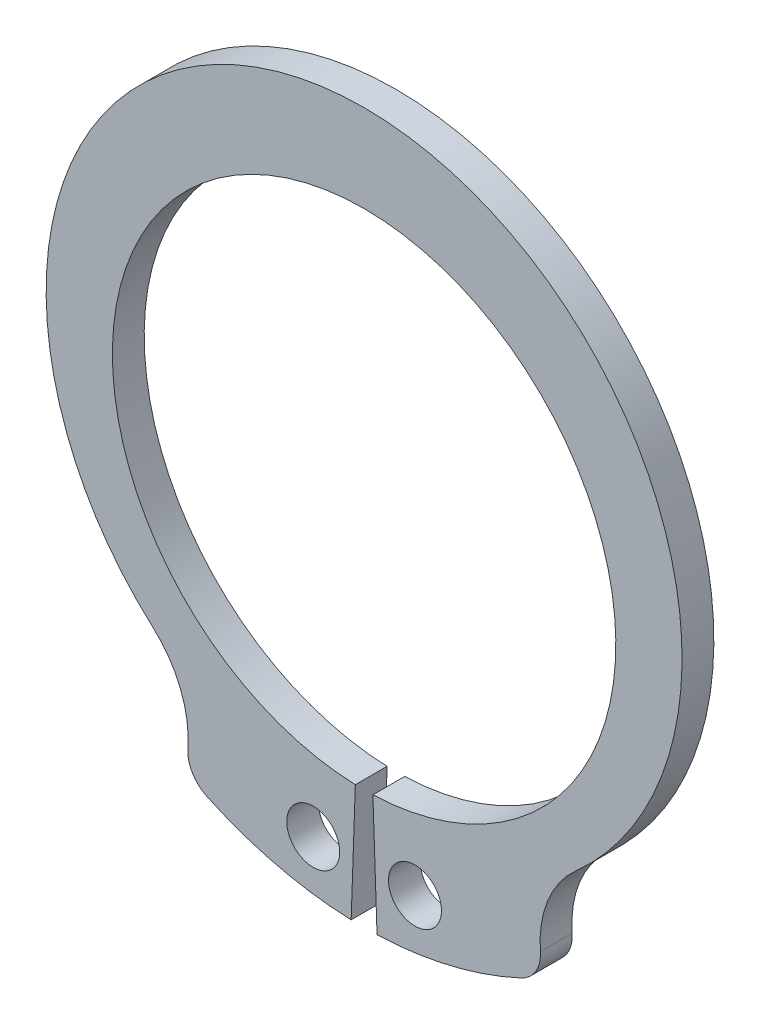
ISO-10303-21;
HEADER;
FILE_DESCRIPTION(('STEP AP214'),'2;1');
FILE_NAME('part.step','',(''),(''),'','','');
FILE_SCHEMA(('AUTOMOTIVE_DESIGN { 1 0 10303 214 1 1 1 1 }'));
ENDSEC;
DATA;
#1=APPLICATION_CONTEXT('core data for automotive mechanical design processes');
#2=APPLICATION_PROTOCOL_DEFINITION('international standard','automotive_design',2000,#1);
#3=PRODUCT_CONTEXT('',#1,'mechanical');
#4=PRODUCT('Part','Part','',(#3));
#5=PRODUCT_RELATED_PRODUCT_CATEGORY('part','',(#4));
#6=PRODUCT_DEFINITION_FORMATION('','',#4);
#7=PRODUCT_DEFINITION_CONTEXT('part definition',#1,'design');
#8=PRODUCT_DEFINITION('design','',#6,#7);
#9=PRODUCT_DEFINITION_SHAPE('','',#8);
#10=(LENGTH_UNIT() NAMED_UNIT(*) SI_UNIT(.MILLI.,.METRE.));
#11=(NAMED_UNIT(*) PLANE_ANGLE_UNIT() SI_UNIT($,.RADIAN.));
#12=(NAMED_UNIT(*) SI_UNIT($,.STERADIAN.) SOLID_ANGLE_UNIT());
#13=UNCERTAINTY_MEASURE_WITH_UNIT(LENGTH_MEASURE(1.E-05),#10,'distance_accuracy_value','');
#14=(GEOMETRIC_REPRESENTATION_CONTEXT(3) GLOBAL_UNCERTAINTY_ASSIGNED_CONTEXT((#13)) GLOBAL_UNIT_ASSIGNED_CONTEXT((#10,
#11,#12)) REPRESENTATION_CONTEXT('',''));
#15=CARTESIAN_POINT('',(0.,0.,0.));
#16=DIRECTION('',(0.,0.,1.));
#17=DIRECTION('',(1.,0.,0.));
#18=AXIS2_PLACEMENT_3D('',#15,#16,#17);
#19=CARTESIAN_POINT('',(10.6411285697582,-11.1484887229254,1.2));
#20=DIRECTION('',(0.,0.,-1.));
#21=DIRECTION('',(-1.,0.,0.));
#22=AXIS2_PLACEMENT_3D('',#19,#20,#21);
#23=CYLINDRICAL_SURFACE('',#22,4.);
#24=CARTESIAN_POINT('',(10.6411285697582,-11.1484887229254,0.));
#25=DIRECTION('',(0.,0.,1.));
#26=DIRECTION('',(1.,0.,0.));
#27=AXIS2_PLACEMENT_3D('',#24,#25,#26);
#28=CIRCLE('',#27,4.);
#29=CARTESIAN_POINT('',(7.98084642731865,-8.16136654219406,0.));
#30=VERTEX_POINT('',#29);
#31=CARTESIAN_POINT('',(6.65267252069166,-11.4521634579043,0.));
#32=VERTEX_POINT('',#31);
#33=EDGE_CURVE('E149',#30,#32,#28,.T.);
#34=ORIENTED_EDGE('',*,*,#33,.F.);
#35=DIRECTION('',(0.,0.,-1.));
#36=VECTOR('',#35,1.);
#37=CARTESIAN_POINT('',(7.98084642731865,-8.16136654219406,1.2));
#38=LINE('',#37,#36);
#39=CARTESIAN_POINT('',(7.98084642731865,-8.16136654219406,1.2));
#40=VERTEX_POINT('',#39);
#41=EDGE_CURVE('E11',#40,#30,#38,.T.);
#42=ORIENTED_EDGE('',*,*,#41,.F.);
#43=CARTESIAN_POINT('',(10.6411285697582,-11.1484887229254,1.2));
#44=DIRECTION('',(0.,0.,1.));
#45=DIRECTION('',(1.,0.,0.));
#46=AXIS2_PLACEMENT_3D('',#43,#44,#45);
#47=CIRCLE('',#46,4.);
#48=CARTESIAN_POINT('',(6.65267252069166,-11.4521634579043,1.2));
#49=VERTEX_POINT('',#48);
#50=EDGE_CURVE('E179',#40,#49,#47,.T.);
#51=ORIENTED_EDGE('',*,*,#50,.T.);
#52=DIRECTION('',(0.,0.,-1.));
#53=VECTOR('',#52,1.);
#54=CARTESIAN_POINT('',(6.65267252069166,-11.4521634579043,1.2));
#55=LINE('',#54,#53);
#56=EDGE_CURVE('E94',#49,#32,#55,.T.);
#57=ORIENTED_EDGE('',*,*,#56,.T.);
#58=EDGE_LOOP('',(#34,#42,#51,#57));
#59=FACE_BOUND('',#58,.T.);
#60=ADVANCED_FACE('F37',(#59),#23,.F.);
#61=CARTESIAN_POINT('',(0.,0.8,1.2));
#62=DIRECTION('',(0.,0.,-1.));
#63=DIRECTION('',(-1.,0.,0.));
#64=AXIS2_PLACEMENT_3D('',#61,#62,#63);
#65=CYLINDRICAL_SURFACE('',#64,12.);
#66=CARTESIAN_POINT('',(0.,0.8,0.));
#67=DIRECTION('',(0.,0.,1.));
#68=DIRECTION('',(1.,0.,0.));
#69=AXIS2_PLACEMENT_3D('',#66,#67,#68);
#70=CIRCLE('',#69,12.);
#71=CARTESIAN_POINT('',(-7.98084642731865,-8.16136654219406,0.));
#72=VERTEX_POINT('',#71);
#73=EDGE_CURVE('E152',#30,#72,#70,.T.);
#74=ORIENTED_EDGE('',*,*,#73,.T.);
#75=DIRECTION('',(0.,0.,-1.));
#76=VECTOR('',#75,1.);
#77=CARTESIAN_POINT('',(-7.98084642731865,-8.16136654219406,1.2));
#78=LINE('',#77,#76);
#79=CARTESIAN_POINT('',(-7.98084642731865,-8.16136654219406,1.2));
#80=VERTEX_POINT('',#79);
#81=EDGE_CURVE('E45',#80,#72,#78,.T.);
#82=ORIENTED_EDGE('',*,*,#81,.F.);
#83=CARTESIAN_POINT('',(0.,0.8,1.2));
#84=DIRECTION('',(0.,0.,1.));
#85=DIRECTION('',(1.,0.,0.));
#86=AXIS2_PLACEMENT_3D('',#83,#84,#85);
#87=CIRCLE('',#86,12.);
#88=EDGE_CURVE('E215',#40,#80,#87,.T.);
#89=ORIENTED_EDGE('',*,*,#88,.F.);
#90=ORIENTED_EDGE('',*,*,#41,.T.);
#91=EDGE_LOOP('',(#74,#82,#89,#90));
#92=FACE_BOUND('',#91,.T.);
#93=ADVANCED_FACE('F228',(#92),#65,.T.);
#94=CARTESIAN_POINT('',(-10.6411285697582,-11.1484887229254,1.2));
#95=DIRECTION('',(0.,0.,-1.));
#96=DIRECTION('',(-1.,0.,0.));
#97=AXIS2_PLACEMENT_3D('',#94,#95,#96);
#98=CYLINDRICAL_SURFACE('',#97,4.);
#99=CARTESIAN_POINT('',(-10.6411285697582,-11.1484887229254,0.));
#100=DIRECTION('',(0.,0.,1.));
#101=DIRECTION('',(1.,0.,0.));
#102=AXIS2_PLACEMENT_3D('',#99,#100,#101);
#103=CIRCLE('',#102,4.);
#104=CARTESIAN_POINT('',(-6.65267252069166,-11.4521634579043,0.));
#105=VERTEX_POINT('',#104);
#106=EDGE_CURVE('E154',#72,#105,#103,.F.);
#107=ORIENTED_EDGE('',*,*,#106,.T.);
#108=DIRECTION('',(0.,0.,-1.));
#109=VECTOR('',#108,1.);
#110=CARTESIAN_POINT('',(-6.65267252069166,-11.4521634579043,1.2));
#111=LINE('',#110,#109);
#112=CARTESIAN_POINT('',(-6.65267252069166,-11.4521634579043,1.2));
#113=VERTEX_POINT('',#112);
#114=EDGE_CURVE('E189',#113,#105,#111,.T.);
#115=ORIENTED_EDGE('',*,*,#114,.F.);
#116=CARTESIAN_POINT('',(-10.6411285697582,-11.1484887229254,1.2));
#117=DIRECTION('',(0.,0.,1.));
#118=DIRECTION('',(1.,0.,0.));
#119=AXIS2_PLACEMENT_3D('',#116,#117,#118);
#120=CIRCLE('',#119,4.);
#121=EDGE_CURVE('E197',#80,#113,#120,.F.);
#122=ORIENTED_EDGE('',*,*,#121,.F.);
#123=ORIENTED_EDGE('',*,*,#81,.T.);
#124=EDGE_LOOP('',(#107,#115,#122,#123));
#125=FACE_BOUND('',#124,.T.);
#126=ADVANCED_FACE('F195',(#125),#98,.F.);
#127=CARTESIAN_POINT('',(-5.40628000535836,-11.5470618125852,1.2));
#128=DIRECTION('',(0.,0.,-1.));
#129=DIRECTION('',(-1.,0.,0.));
#130=AXIS2_PLACEMENT_3D('',#127,#128,#129);
#131=CYLINDRICAL_SURFACE('',#130,1.25);
#132=CARTESIAN_POINT('',(-5.40628000535836,-11.5470618125852,0.));
#133=DIRECTION('',(0.,0.,1.));
#134=DIRECTION('',(1.,0.,0.));
#135=AXIS2_PLACEMENT_3D('',#132,#133,#134);
#136=CIRCLE('',#135,1.25);
#137=CARTESIAN_POINT('',(-5.93630745686408,-12.6791266961719,0.));
#138=VERTEX_POINT('',#137);
#139=EDGE_CURVE('E157',#138,#105,#136,.F.);
#140=ORIENTED_EDGE('',*,*,#139,.F.);
#141=DIRECTION('',(0.,0.,-1.));
#142=VECTOR('',#141,1.);
#143=CARTESIAN_POINT('',(-5.93630745686408,-12.6791266961719,1.2));
#144=LINE('',#143,#142);
#145=CARTESIAN_POINT('',(-5.93630745686408,-12.6791266961719,1.2));
#146=VERTEX_POINT('',#145);
#147=EDGE_CURVE('E187',#146,#138,#144,.T.);
#148=ORIENTED_EDGE('',*,*,#147,.F.);
#149=CARTESIAN_POINT('',(-5.40628000535836,-11.5470618125852,1.2));
#150=DIRECTION('',(0.,0.,1.));
#151=DIRECTION('',(1.,0.,0.));
#152=AXIS2_PLACEMENT_3D('',#149,#150,#151);
#153=CIRCLE('',#152,1.25);
#154=EDGE_CURVE('E210',#146,#113,#153,.F.);
#155=ORIENTED_EDGE('',*,*,#154,.T.);
#156=ORIENTED_EDGE('',*,*,#114,.T.);
#157=EDGE_LOOP('',(#140,#148,#155,#156));
#158=FACE_BOUND('',#157,.T.);
#159=ADVANCED_FACE('F206',(#158),#131,.T.);
#160=CARTESIAN_POINT('',(0.,0.,1.2));
#161=DIRECTION('',(0.,0.,-1.));
#162=DIRECTION('',(-1.,0.,0.));
#163=AXIS2_PLACEMENT_3D('',#160,#161,#162);
#164=CYLINDRICAL_SURFACE('',#163,14.);
#165=CARTESIAN_POINT('',(0.,0.,0.));
#166=DIRECTION('',(0.,0.,1.));
#167=DIRECTION('',(1.,0.,0.));
#168=AXIS2_PLACEMENT_3D('',#165,#166,#167);
#169=CIRCLE('',#168,14.);
#170=CARTESIAN_POINT('',(-0.488592953835013,-13.9914715782673,0.));
#171=VERTEX_POINT('',#170);
#172=EDGE_CURVE('E160',#138,#171,#169,.T.);
#173=ORIENTED_EDGE('',*,*,#172,.T.);
#174=DIRECTION('',(0.,0.,-1.));
#175=VECTOR('',#174,1.);
#176=CARTESIAN_POINT('',(-0.488592953835013,-13.9914715782673,1.2));
#177=LINE('',#176,#175);
#178=CARTESIAN_POINT('',(-0.488592953835013,-13.9914715782673,1.2));
#179=VERTEX_POINT('',#178);
#180=EDGE_CURVE('E185',#179,#171,#177,.T.);
#181=ORIENTED_EDGE('',*,*,#180,.F.);
#182=CARTESIAN_POINT('',(0.,0.,1.2));
#183=DIRECTION('',(0.,0.,1.));
#184=DIRECTION('',(1.,0.,0.));
#185=AXIS2_PLACEMENT_3D('',#182,#183,#184);
#186=CIRCLE('',#185,14.);
#187=EDGE_CURVE('E211',#146,#179,#186,.T.);
#188=ORIENTED_EDGE('',*,*,#187,.F.);
#189=ORIENTED_EDGE('',*,*,#147,.T.);
#190=EDGE_LOOP('',(#173,#181,#188,#189));
#191=FACE_BOUND('',#190,.T.);
#192=ADVANCED_FACE('F238',(#191),#164,.T.);
#193=CARTESIAN_POINT('',(0.,0.,1.2));
#194=DIRECTION('',(0.999390827019096,-0.0348994967025009,0.));
#195=DIRECTION('',(0.0348994967025009,0.999390827019096,0.));
#196=AXIS2_PLACEMENT_3D('',#193,#194,#195);
#197=PLANE('',#196);
#198=DIRECTION('',(-0.0348994967025009,-0.999390827019096,0.));
#199=VECTOR('',#198,1.);
#200=CARTESIAN_POINT('',(0.,0.,0.));
#201=LINE('',#200,#199);
#202=CARTESIAN_POINT('',(-0.331545218673759,-9.49421285668141,0.));
#203=VERTEX_POINT('',#202);
#204=EDGE_CURVE('E163',#203,#171,#201,.T.);
#205=ORIENTED_EDGE('',*,*,#204,.F.);
#206=DIRECTION('',(0.,0.,-1.));
#207=VECTOR('',#206,1.);
#208=CARTESIAN_POINT('',(-0.331545218673759,-9.49421285668141,1.2));
#209=LINE('',#208,#207);
#210=CARTESIAN_POINT('',(-0.331545218673759,-9.49421285668141,1.2));
#211=VERTEX_POINT('',#210);
#212=EDGE_CURVE('E183',#211,#203,#209,.T.);
#213=ORIENTED_EDGE('',*,*,#212,.F.);
#214=DIRECTION('',(-0.0348994967025009,-0.999390827019096,0.));
#215=VECTOR('',#214,1.);
#216=CARTESIAN_POINT('',(0.,0.,1.2));
#217=LINE('',#216,#215);
#218=EDGE_CURVE('E213',#211,#179,#217,.T.);
#219=ORIENTED_EDGE('',*,*,#218,.T.);
#220=ORIENTED_EDGE('',*,*,#180,.T.);
#221=EDGE_LOOP('',(#205,#213,#219,#220));
#222=FACE_BOUND('',#221,.T.);
#223=ADVANCED_FACE('F241',(#222),#197,.T.);
#224=CARTESIAN_POINT('',(0.,0.,1.2));
#225=DIRECTION('',(0.,0.,-1.));
#226=DIRECTION('',(-1.,0.,0.));
#227=AXIS2_PLACEMENT_3D('',#224,#225,#226);
#228=CYLINDRICAL_SURFACE('',#227,9.5);
#229=CARTESIAN_POINT('',(0.,0.,0.));
#230=DIRECTION('',(0.,0.,1.));
#231=DIRECTION('',(1.,0.,0.));
#232=AXIS2_PLACEMENT_3D('',#229,#230,#231);
#233=CIRCLE('',#232,9.5);
#234=CARTESIAN_POINT('',(0.331545218673761,-9.49421285668141,0.));
#235=VERTEX_POINT('',#234);
#236=EDGE_CURVE('E166',#235,#203,#233,.T.);
#237=ORIENTED_EDGE('',*,*,#236,.F.);
#238=DIRECTION('',(0.,0.,-1.));
#239=VECTOR('',#238,1.);
#240=CARTESIAN_POINT('',(0.331545218673761,-9.49421285668141,1.2));
#241=LINE('',#240,#239);
#242=CARTESIAN_POINT('',(0.331545218673761,-9.49421285668141,1.2));
#243=VERTEX_POINT('',#242);
#244=EDGE_CURVE('E135',#243,#235,#241,.T.);
#245=ORIENTED_EDGE('',*,*,#244,.F.);
#246=CARTESIAN_POINT('',(0.,0.,1.2));
#247=DIRECTION('',(0.,0.,1.));
#248=DIRECTION('',(1.,0.,0.));
#249=AXIS2_PLACEMENT_3D('',#246,#247,#248);
#250=CIRCLE('',#249,9.5);
#251=EDGE_CURVE('E128',#243,#211,#250,.T.);
#252=ORIENTED_EDGE('',*,*,#251,.T.);
#253=ORIENTED_EDGE('',*,*,#212,.T.);
#254=EDGE_LOOP('',(#237,#245,#252,#253));
#255=FACE_BOUND('',#254,.T.);
#256=ADVANCED_FACE('F222',(#255),#228,.F.);
#257=CARTESIAN_POINT('',(0.,0.,1.2));
#258=DIRECTION('',(0.999390827019096,0.0348994967025012,0.));
#259=DIRECTION('',(-0.0348994967025012,0.999390827019096,0.));
#260=AXIS2_PLACEMENT_3D('',#257,#258,#259);
#261=PLANE('',#260);
#262=DIRECTION('',(0.0348994967025012,-0.999390827019096,0.));
#263=VECTOR('',#262,1.);
#264=CARTESIAN_POINT('',(0.,0.,0.));
#265=LINE('',#264,#263);
#266=CARTESIAN_POINT('',(0.488592953835016,-13.9914715782673,0.));
#267=VERTEX_POINT('',#266);
#268=EDGE_CURVE('E134',#235,#267,#265,.T.);
#269=ORIENTED_EDGE('',*,*,#268,.T.);
#270=DIRECTION('',(0.,0.,-1.));
#271=VECTOR('',#270,1.);
#272=CARTESIAN_POINT('',(0.488592953835016,-13.9914715782673,1.2));
#273=LINE('',#272,#271);
#274=CARTESIAN_POINT('',(0.488592953835016,-13.9914715782673,1.2));
#275=VERTEX_POINT('',#274);
#276=EDGE_CURVE('E131',#275,#267,#273,.T.);
#277=ORIENTED_EDGE('',*,*,#276,.F.);
#278=DIRECTION('',(0.0348994967025012,-0.999390827019096,0.));
#279=VECTOR('',#278,1.);
#280=CARTESIAN_POINT('',(0.,0.,1.2));
#281=LINE('',#280,#279);
#282=EDGE_CURVE('E120',#243,#275,#281,.T.);
#283=ORIENTED_EDGE('',*,*,#282,.F.);
#284=ORIENTED_EDGE('',*,*,#244,.T.);
#285=EDGE_LOOP('',(#269,#277,#283,#284));
#286=FACE_BOUND('',#285,.T.);
#287=ADVANCED_FACE('F132',(#286),#261,.F.);
#288=CARTESIAN_POINT('',(0.,0.,1.2));
#289=DIRECTION('',(0.,0.,-1.));
#290=DIRECTION('',(-1.,0.,0.));
#291=AXIS2_PLACEMENT_3D('',#288,#289,#290);
#292=CYLINDRICAL_SURFACE('',#291,14.);
#293=CARTESIAN_POINT('',(0.,0.,0.));
#294=DIRECTION('',(0.,0.,1.));
#295=DIRECTION('',(1.,0.,0.));
#296=AXIS2_PLACEMENT_3D('',#293,#294,#295);
#297=CIRCLE('',#296,14.);
#298=CARTESIAN_POINT('',(5.93630745686408,-12.6791266961719,0.));
#299=VERTEX_POINT('',#298);
#300=EDGE_CURVE('E87',#267,#299,#297,.T.);
#301=ORIENTED_EDGE('',*,*,#300,.T.);
#302=DIRECTION('',(0.,0.,-1.));
#303=VECTOR('',#302,1.);
#304=CARTESIAN_POINT('',(5.93630745686408,-12.6791266961719,1.2));
#305=LINE('',#304,#303);
#306=CARTESIAN_POINT('',(5.93630745686408,-12.6791266961719,1.2));
#307=VERTEX_POINT('',#306);
#308=EDGE_CURVE('E136',#307,#299,#305,.T.);
#309=ORIENTED_EDGE('',*,*,#308,.F.);
#310=CARTESIAN_POINT('',(0.,0.,1.2));
#311=DIRECTION('',(0.,0.,1.));
#312=DIRECTION('',(1.,0.,0.));
#313=AXIS2_PLACEMENT_3D('',#310,#311,#312);
#314=CIRCLE('',#313,14.);
#315=EDGE_CURVE('E125',#275,#307,#314,.T.);
#316=ORIENTED_EDGE('',*,*,#315,.F.);
#317=ORIENTED_EDGE('',*,*,#276,.T.);
#318=EDGE_LOOP('',(#301,#309,#316,#317));
#319=FACE_BOUND('',#318,.T.);
#320=ADVANCED_FACE('F138',(#319),#292,.T.);
#321=CARTESIAN_POINT('',(-1.91966573129975,-11.9914715782673,1.2));
#322=DIRECTION('',(0.,0.,-1.));
#323=DIRECTION('',(-1.,0.,0.));
#324=AXIS2_PLACEMENT_3D('',#321,#322,#323);
#325=CYLINDRICAL_SURFACE('',#324,1.);
#326=CARTESIAN_POINT('',(-1.91966573129975,-11.9914715782673,1.2));
#327=DIRECTION('',(0.,0.,1.));
#328=DIRECTION('',(1.,0.,0.));
#329=AXIS2_PLACEMENT_3D('',#326,#327,#328);
#330=CIRCLE('',#329,1.);
#331=CARTESIAN_POINT('',(-0.919665731299753,-11.9914715782673,1.2));
#332=VERTEX_POINT('',#331);
#333=EDGE_CURVE('E140',#332,#332,#330,.F.);
#334=ORIENTED_EDGE('',*,*,#333,.F.);
#335=EDGE_LOOP('',(#334));
#336=FACE_BOUND('',#335,.T.);
#337=CARTESIAN_POINT('',(-1.91966573129975,-11.9914715782673,0.));
#338=DIRECTION('',(0.,0.,1.));
#339=DIRECTION('',(1.,0.,0.));
#340=AXIS2_PLACEMENT_3D('',#337,#338,#339);
#341=CIRCLE('',#340,1.);
#342=CARTESIAN_POINT('',(-0.919665731299753,-11.9914715782673,0.));
#343=VERTEX_POINT('',#342);
#344=EDGE_CURVE('E173',#343,#343,#341,.F.);
#345=ORIENTED_EDGE('',*,*,#344,.T.);
#346=EDGE_LOOP('',(#345));
#347=FACE_BOUND('',#346,.T.);
#348=ADVANCED_FACE('F252',(#336,#347),#325,.F.);
#349=CARTESIAN_POINT('',(5.40628000535836,-11.5470618125852,1.2));
#350=DIRECTION('',(0.,0.,-1.));
#351=DIRECTION('',(-1.,0.,0.));
#352=AXIS2_PLACEMENT_3D('',#349,#350,#351);
#353=CYLINDRICAL_SURFACE('',#352,1.25);
#354=CARTESIAN_POINT('',(5.40628000535836,-11.5470618125852,0.));
#355=DIRECTION('',(0.,0.,1.));
#356=DIRECTION('',(1.,0.,0.));
#357=AXIS2_PLACEMENT_3D('',#354,#355,#356);
#358=CIRCLE('',#357,1.25);
#359=EDGE_CURVE('E171',#299,#32,#358,.T.);
#360=ORIENTED_EDGE('',*,*,#359,.T.);
#361=ORIENTED_EDGE('',*,*,#56,.F.);
#362=CARTESIAN_POINT('',(5.40628000535836,-11.5470618125852,1.2));
#363=DIRECTION('',(0.,0.,1.));
#364=DIRECTION('',(1.,0.,0.));
#365=AXIS2_PLACEMENT_3D('',#362,#363,#364);
#366=CIRCLE('',#365,1.25);
#367=EDGE_CURVE('E53',#307,#49,#366,.T.);
#368=ORIENTED_EDGE('',*,*,#367,.F.);
#369=ORIENTED_EDGE('',*,*,#308,.T.);
#370=EDGE_LOOP('',(#360,#361,#368,#369));
#371=FACE_BOUND('',#370,.T.);
#372=ADVANCED_FACE('F226',(#371),#353,.T.);
#373=CARTESIAN_POINT('',(1.91966573129975,-11.9914715782673,1.2));
#374=DIRECTION('',(0.,0.,-1.));
#375=DIRECTION('',(-1.,0.,0.));
#376=AXIS2_PLACEMENT_3D('',#373,#374,#375);
#377=CYLINDRICAL_SURFACE('',#376,1.);
#378=CARTESIAN_POINT('',(1.91966573129975,-11.9914715782673,1.2));
#379=DIRECTION('',(0.,0.,1.));
#380=DIRECTION('',(1.,0.,0.));
#381=AXIS2_PLACEMENT_3D('',#378,#379,#380);
#382=CIRCLE('',#381,1.);
#383=CARTESIAN_POINT('',(2.91966573129975,-11.9914715782673,1.2));
#384=VERTEX_POINT('',#383);
#385=EDGE_CURVE('E146',#384,#384,#382,.T.);
#386=ORIENTED_EDGE('',*,*,#385,.T.);
#387=EDGE_LOOP('',(#386));
#388=FACE_BOUND('',#387,.T.);
#389=CARTESIAN_POINT('',(1.91966573129975,-11.9914715782673,0.));
#390=DIRECTION('',(0.,0.,1.));
#391=DIRECTION('',(1.,0.,0.));
#392=AXIS2_PLACEMENT_3D('',#389,#390,#391);
#393=CIRCLE('',#392,1.);
#394=CARTESIAN_POINT('',(2.91966573129975,-11.9914715782673,0.));
#395=VERTEX_POINT('',#394);
#396=EDGE_CURVE('E176',#395,#395,#393,.T.);
#397=ORIENTED_EDGE('',*,*,#396,.F.);
#398=EDGE_LOOP('',(#397));
#399=FACE_BOUND('',#398,.T.);
#400=ADVANCED_FACE('F255',(#388,#399),#377,.F.);
#401=CARTESIAN_POINT('',(0.,0.,1.2));
#402=DIRECTION('',(0.,0.,1.));
#403=DIRECTION('',(1.,0.,0.));
#404=AXIS2_PLACEMENT_3D('',#401,#402,#403);
#405=PLANE('',#404);
#406=ORIENTED_EDGE('',*,*,#50,.F.);
#407=ORIENTED_EDGE('',*,*,#88,.T.);
#408=ORIENTED_EDGE('',*,*,#121,.T.);
#409=ORIENTED_EDGE('',*,*,#154,.F.);
#410=ORIENTED_EDGE('',*,*,#187,.T.);
#411=ORIENTED_EDGE('',*,*,#218,.F.);
#412=ORIENTED_EDGE('',*,*,#251,.F.);
#413=ORIENTED_EDGE('',*,*,#282,.T.);
#414=ORIENTED_EDGE('',*,*,#315,.T.);
#415=ORIENTED_EDGE('',*,*,#367,.T.);
#416=EDGE_LOOP('',(#406,#407,#408,#409,#410,#411,#412,#413,#414,#415));
#417=FACE_BOUND('',#416,.T.);
#418=ORIENTED_EDGE('',*,*,#333,.T.);
#419=EDGE_LOOP('',(#418));
#420=FACE_BOUND('',#419,.T.);
#421=ORIENTED_EDGE('',*,*,#385,.F.);
#422=EDGE_LOOP('',(#421));
#423=FACE_BOUND('',#422,.T.);
#424=ADVANCED_FACE('F122',(#417,#420,#423),#405,.T.);
#425=CARTESIAN_POINT('',(0.,0.,0.));
#426=DIRECTION('',(0.,0.,1.));
#427=DIRECTION('',(1.,0.,0.));
#428=AXIS2_PLACEMENT_3D('',#425,#426,#427);
#429=PLANE('',#428);
#430=ORIENTED_EDGE('',*,*,#33,.T.);
#431=ORIENTED_EDGE('',*,*,#359,.F.);
#432=ORIENTED_EDGE('',*,*,#300,.F.);
#433=ORIENTED_EDGE('',*,*,#268,.F.);
#434=ORIENTED_EDGE('',*,*,#236,.T.);
#435=ORIENTED_EDGE('',*,*,#204,.T.);
#436=ORIENTED_EDGE('',*,*,#172,.F.);
#437=ORIENTED_EDGE('',*,*,#139,.T.);
#438=ORIENTED_EDGE('',*,*,#106,.F.);
#439=ORIENTED_EDGE('',*,*,#73,.F.);
#440=EDGE_LOOP('',(#430,#431,#432,#433,#434,#435,#436,#437,#438,#439));
#441=FACE_BOUND('',#440,.T.);
#442=ORIENTED_EDGE('',*,*,#344,.F.);
#443=EDGE_LOOP('',(#442));
#444=FACE_BOUND('',#443,.T.);
#445=ORIENTED_EDGE('',*,*,#396,.T.);
#446=EDGE_LOOP('',(#445));
#447=FACE_BOUND('',#446,.T.);
#448=ADVANCED_FACE('F201',(#441,#444,#447),#429,.F.);
#449=CLOSED_SHELL('',(#60,#93,#126,#159,#192,#223,#256,#287,#320,#348,#372,#400,#424,#448));
#450=MANIFOLD_SOLID_BREP('B2',#449);
#451=ADVANCED_BREP_SHAPE_REPRESENTATION('',(#18,#450),#14);
#452=SHAPE_DEFINITION_REPRESENTATION(#9,#451);
ENDSEC;
END-ISO-10303-21;
